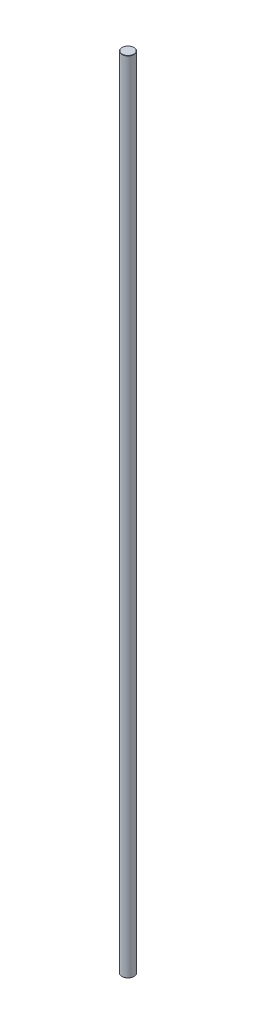
ISO-10303-21;
HEADER;
FILE_DESCRIPTION(('STEP AP214'),'2;1');
FILE_NAME('part.step','',(''),(''),'','','');
FILE_SCHEMA(('AUTOMOTIVE_DESIGN { 1 0 10303 214 1 1 1 1 }'));
ENDSEC;
DATA;
#1=APPLICATION_CONTEXT('core data for automotive mechanical design processes');
#2=APPLICATION_PROTOCOL_DEFINITION('international standard','automotive_design',2000,#1);
#3=PRODUCT_CONTEXT('',#1,'mechanical');
#4=PRODUCT('Part','Part','',(#3));
#5=PRODUCT_RELATED_PRODUCT_CATEGORY('part','',(#4));
#6=PRODUCT_DEFINITION_FORMATION('','',#4);
#7=PRODUCT_DEFINITION_CONTEXT('part definition',#1,'design');
#8=PRODUCT_DEFINITION('design','',#6,#7);
#9=PRODUCT_DEFINITION_SHAPE('','',#8);
#10=(LENGTH_UNIT() NAMED_UNIT(*) SI_UNIT(.MILLI.,.METRE.));
#11=(NAMED_UNIT(*) PLANE_ANGLE_UNIT() SI_UNIT($,.RADIAN.));
#12=(NAMED_UNIT(*) SI_UNIT($,.STERADIAN.) SOLID_ANGLE_UNIT());
#13=UNCERTAINTY_MEASURE_WITH_UNIT(LENGTH_MEASURE(1.E-05),#10,'distance_accuracy_value','');
#14=(GEOMETRIC_REPRESENTATION_CONTEXT(3) GLOBAL_UNCERTAINTY_ASSIGNED_CONTEXT((#13)) GLOBAL_UNIT_ASSIGNED_CONTEXT((#10,
#11,#12)) REPRESENTATION_CONTEXT('',''));
#15=CARTESIAN_POINT('',(0.,0.,0.));
#16=DIRECTION('',(0.,0.,1.));
#17=DIRECTION('',(1.,0.,0.));
#18=AXIS2_PLACEMENT_3D('',#15,#16,#17);
#19=CARTESIAN_POINT('',(0.,419.1,0.));
#20=DIRECTION('',(0.,-1.,0.));
#21=DIRECTION('',(0.,0.,-1.));
#22=AXIS2_PLACEMENT_3D('',#19,#20,#21);
#23=CYLINDRICAL_SURFACE('',#22,6.35);
#24=CARTESIAN_POINT('',(0.,-418.846,0.));
#25=DIRECTION('',(0.,1.,0.));
#26=DIRECTION('',(0.,0.,1.));
#27=AXIS2_PLACEMENT_3D('',#24,#25,#26);
#28=CIRCLE('',#27,6.35);
#29=CARTESIAN_POINT('',(0.,-418.846,6.35));
#30=VERTEX_POINT('',#29);
#31=EDGE_CURVE('E44',#30,#30,#28,.T.);
#32=ORIENTED_EDGE('',*,*,#31,.T.);
#33=EDGE_LOOP('',(#32));
#34=FACE_BOUND('',#33,.T.);
#35=CARTESIAN_POINT('',(0.,418.846,0.));
#36=DIRECTION('',(0.,1.,0.));
#37=DIRECTION('',(0.,0.,1.));
#38=AXIS2_PLACEMENT_3D('',#35,#36,#37);
#39=CIRCLE('',#38,6.35);
#40=CARTESIAN_POINT('',(0.,418.846,6.35));
#41=VERTEX_POINT('',#40);
#42=EDGE_CURVE('E48',#41,#41,#39,.F.);
#43=ORIENTED_EDGE('',*,*,#42,.T.);
#44=EDGE_LOOP('',(#43));
#45=FACE_BOUND('',#44,.T.);
#46=ADVANCED_FACE('F33',(#34,#45),#23,.T.);
#47=CARTESIAN_POINT('',(0.,419.1,0.));
#48=DIRECTION('',(0.,1.,0.));
#49=DIRECTION('',(0.,0.,1.));
#50=AXIS2_PLACEMENT_3D('',#47,#48,#49);
#51=PLANE('',#50);
#52=CARTESIAN_POINT('',(0.,419.1,0.));
#53=DIRECTION('',(0.,1.,0.));
#54=DIRECTION('',(0.,0.,1.));
#55=AXIS2_PLACEMENT_3D('',#52,#53,#54);
#56=CIRCLE('',#55,6.0960000000001);
#57=CARTESIAN_POINT('',(0.,419.1,6.0960000000001));
#58=VERTEX_POINT('',#57);
#59=EDGE_CURVE('E10',#58,#58,#56,.T.);
#60=ORIENTED_EDGE('',*,*,#59,.T.);
#61=EDGE_LOOP('',(#60));
#62=FACE_BOUND('',#61,.T.);
#63=ADVANCED_FACE('F64',(#62),#51,.T.);
#64=CARTESIAN_POINT('',(0.,-419.1,0.));
#65=DIRECTION('',(0.,1.,0.));
#66=DIRECTION('',(0.,0.,1.));
#67=AXIS2_PLACEMENT_3D('',#64,#65,#66);
#68=PLANE('',#67);
#69=CARTESIAN_POINT('',(0.,-419.1,0.));
#70=DIRECTION('',(0.,1.,0.));
#71=DIRECTION('',(0.,0.,1.));
#72=AXIS2_PLACEMENT_3D('',#69,#70,#71);
#73=CIRCLE('',#72,6.09599999999988);
#74=CARTESIAN_POINT('',(0.,-419.1,6.09599999999988));
#75=VERTEX_POINT('',#74);
#76=EDGE_CURVE('E40',#75,#75,#73,.F.);
#77=ORIENTED_EDGE('',*,*,#76,.T.);
#78=EDGE_LOOP('',(#77));
#79=FACE_BOUND('',#78,.T.);
#80=ADVANCED_FACE('F61',(#79),#68,.F.);
#81=CARTESIAN_POINT('',(0.,-418.846,0.));
#82=DIRECTION('',(0.,1.,0.));
#83=DIRECTION('',(0.,0.,1.));
#84=AXIS2_PLACEMENT_3D('',#81,#82,#83);
#85=CONICAL_SURFACE('',#84,6.35,0.785398163397513);
#86=ORIENTED_EDGE('',*,*,#76,.F.);
#87=EDGE_LOOP('',(#86));
#88=FACE_BOUND('',#87,.T.);
#89=ORIENTED_EDGE('',*,*,#31,.F.);
#90=EDGE_LOOP('',(#89));
#91=FACE_BOUND('',#90,.T.);
#92=ADVANCED_FACE('F57',(#88,#91),#85,.T.);
#93=CARTESIAN_POINT('',(0.,419.1,0.));
#94=DIRECTION('',(0.,-1.,0.));
#95=DIRECTION('',(0.,0.,-1.));
#96=AXIS2_PLACEMENT_3D('',#93,#94,#95);
#97=CONICAL_SURFACE('',#96,6.0960000000001,0.785398163397185);
#98=ORIENTED_EDGE('',*,*,#42,.F.);
#99=EDGE_LOOP('',(#98));
#100=FACE_BOUND('',#99,.T.);
#101=ORIENTED_EDGE('',*,*,#59,.F.);
#102=EDGE_LOOP('',(#101));
#103=FACE_BOUND('',#102,.T.);
#104=ADVANCED_FACE('F35',(#100,#103),#97,.T.);
#105=CLOSED_SHELL('',(#46,#63,#80,#92,#104));
#106=MANIFOLD_SOLID_BREP('B2',#105);
#107=ADVANCED_BREP_SHAPE_REPRESENTATION('',(#18,#106),#14);
#108=SHAPE_DEFINITION_REPRESENTATION(#9,#107);
ENDSEC;
END-ISO-10303-21;
